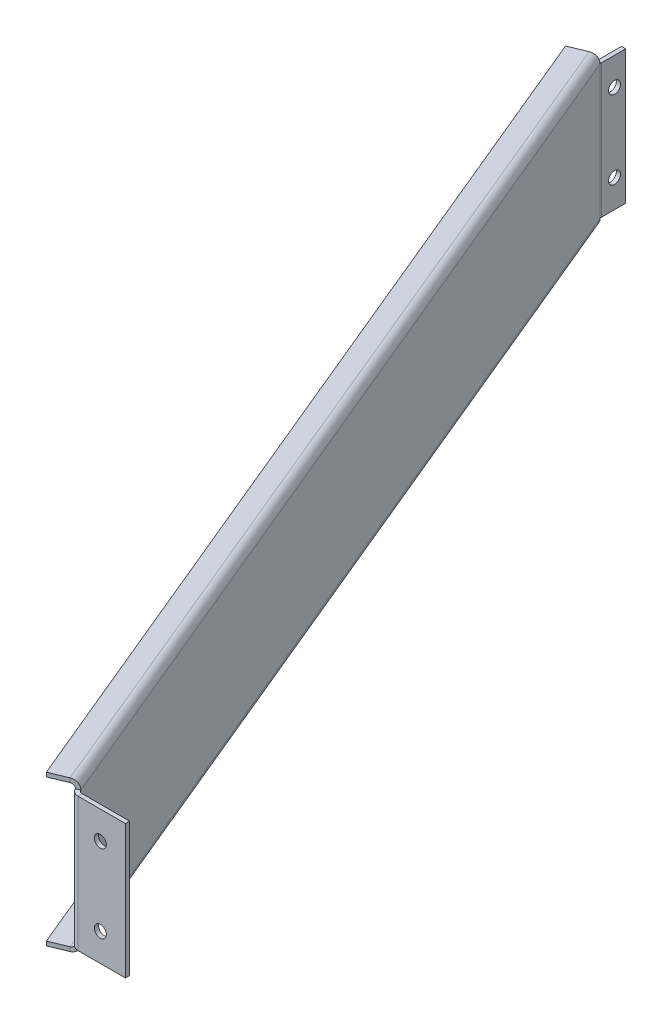
ISO-10303-21;
HEADER;
FILE_DESCRIPTION(('STEP AP214'),'2;1');
FILE_NAME('part.step','',(''),(''),'','','');
FILE_SCHEMA(('AUTOMOTIVE_DESIGN { 1 0 10303 214 1 1 1 1 }'));
ENDSEC;
DATA;
#1=APPLICATION_CONTEXT('core data for automotive mechanical design processes');
#2=APPLICATION_PROTOCOL_DEFINITION('international standard','automotive_design',2000,#1);
#3=PRODUCT_CONTEXT('',#1,'mechanical');
#4=PRODUCT('Part','Part','',(#3));
#5=PRODUCT_RELATED_PRODUCT_CATEGORY('part','',(#4));
#6=PRODUCT_DEFINITION_FORMATION('','',#4);
#7=PRODUCT_DEFINITION_CONTEXT('part definition',#1,'design');
#8=PRODUCT_DEFINITION('design','',#6,#7);
#9=PRODUCT_DEFINITION_SHAPE('','',#8);
#10=(LENGTH_UNIT() NAMED_UNIT(*) SI_UNIT(.MILLI.,.METRE.));
#11=(NAMED_UNIT(*) PLANE_ANGLE_UNIT() SI_UNIT($,.RADIAN.));
#12=(NAMED_UNIT(*) SI_UNIT($,.STERADIAN.) SOLID_ANGLE_UNIT());
#13=UNCERTAINTY_MEASURE_WITH_UNIT(LENGTH_MEASURE(1.E-05),#10,'distance_accuracy_value','');
#14=(GEOMETRIC_REPRESENTATION_CONTEXT(3) GLOBAL_UNCERTAINTY_ASSIGNED_CONTEXT((#13)) GLOBAL_UNIT_ASSIGNED_CONTEXT((#10,
#11,#12)) REPRESENTATION_CONTEXT('',''));
#15=CARTESIAN_POINT('',(0.,0.,0.));
#16=DIRECTION('',(0.,0.,1.));
#17=DIRECTION('',(1.,0.,0.));
#18=AXIS2_PLACEMENT_3D('',#15,#16,#17);
#19=CARTESIAN_POINT('',(63.1148729100365,24.,-319.72361405104));
#20=DIRECTION('',(0.,1.,0.));
#21=DIRECTION('',(0.,0.,1.));
#22=AXIS2_PLACEMENT_3D('',#19,#20,#21);
#23=PLANE('',#22);
#24=DIRECTION('',(-0.923418059975633,0.,0.383795631177372));
#25=VECTOR('',#24,1.);
#26=CARTESIAN_POINT('',(63.1148729100365,24.,-319.72361405104));
#27=LINE('',#26,#25);
#28=CARTESIAN_POINT('',(63.1148729100359,24.,-319.72361405104));
#29=VERTEX_POINT('',#28);
#30=CARTESIAN_POINT('',(61.7297458200725,24.,-319.147920604274));
#31=VERTEX_POINT('',#30);
#32=EDGE_CURVE('E13',#29,#31,#27,.T.);
#33=ORIENTED_EDGE('',*,*,#32,.F.);
#34=CARTESIAN_POINT('',(64.5,24.,-320.299307497806));
#35=DIRECTION('',(0.,-1.,0.));
#36=DIRECTION('',(0.,0.,-1.));
#37=AXIS2_PLACEMENT_3D('',#34,#35,#36);
#38=CIRCLE('',#37,1.5);
#39=CARTESIAN_POINT('',(63.,24.,-320.299307497806));
#40=VERTEX_POINT('',#39);
#41=EDGE_CURVE('E231',#40,#29,#38,.F.);
#42=ORIENTED_EDGE('',*,*,#41,.F.);
#43=DIRECTION('',(1.,0.,0.));
#44=VECTOR('',#43,1.);
#45=CARTESIAN_POINT('',(61.5,24.,-320.299307497806));
#46=LINE('',#45,#44);
#47=CARTESIAN_POINT('',(61.5,24.,-320.299307497806));
#48=VERTEX_POINT('',#47);
#49=EDGE_CURVE('E93',#48,#40,#46,.T.);
#50=ORIENTED_EDGE('',*,*,#49,.F.);
#51=CARTESIAN_POINT('',(64.5,24.,-320.299307497806));
#52=DIRECTION('',(0.,1.,0.));
#53=DIRECTION('',(1.,0.,0.));
#54=AXIS2_PLACEMENT_3D('',#51,#52,#53);
#55=CIRCLE('',#54,3.);
#56=EDGE_CURVE('E221',#48,#31,#55,.T.);
#57=ORIENTED_EDGE('',*,*,#56,.T.);
#58=EDGE_LOOP('',(#33,#42,#50,#57));
#59=FACE_BOUND('',#58,.T.);
#60=ADVANCED_FACE('F84',(#59),#23,.T.);
#61=CARTESIAN_POINT('',(63.,-24.,-320.299307497806));
#62=DIRECTION('',(0.,-1.,0.));
#63=DIRECTION('',(0.,0.,-1.));
#64=AXIS2_PLACEMENT_3D('',#61,#62,#63);
#65=PLANE('',#64);
#66=DIRECTION('',(-1.,0.,0.));
#67=VECTOR('',#66,1.);
#68=CARTESIAN_POINT('',(63.,-24.,-320.299307497806));
#69=LINE('',#68,#67);
#70=CARTESIAN_POINT('',(63.,-24.,-320.299307497806));
#71=VERTEX_POINT('',#70);
#72=CARTESIAN_POINT('',(61.5,-24.,-320.299307497806));
#73=VERTEX_POINT('',#72);
#74=EDGE_CURVE('E338',#71,#73,#69,.T.);
#75=ORIENTED_EDGE('',*,*,#74,.F.);
#76=CARTESIAN_POINT('',(64.5,-24.,-320.299307497806));
#77=DIRECTION('',(0.,-1.,0.));
#78=DIRECTION('',(0.,0.,-1.));
#79=AXIS2_PLACEMENT_3D('',#76,#77,#78);
#80=CIRCLE('',#79,1.5);
#81=CARTESIAN_POINT('',(63.1148729100366,-24.,-319.72361405104));
#82=VERTEX_POINT('',#81);
#83=EDGE_CURVE('E266',#71,#82,#80,.F.);
#84=ORIENTED_EDGE('',*,*,#83,.T.);
#85=DIRECTION('',(0.923418059975633,0.,-0.383795631177372));
#86=VECTOR('',#85,1.);
#87=CARTESIAN_POINT('',(61.7297458200731,-24.,-319.147920604274));
#88=LINE('',#87,#86);
#89=CARTESIAN_POINT('',(61.7297458200731,-24.,-319.147920604274));
#90=VERTEX_POINT('',#89);
#91=EDGE_CURVE('E334',#90,#82,#88,.T.);
#92=ORIENTED_EDGE('',*,*,#91,.F.);
#93=CARTESIAN_POINT('',(64.5,-24.,-320.299307497806));
#94=DIRECTION('',(0.,1.,0.));
#95=DIRECTION('',(1.,0.,0.));
#96=AXIS2_PLACEMENT_3D('',#93,#94,#95);
#97=CIRCLE('',#96,3.);
#98=EDGE_CURVE('E279',#73,#90,#97,.T.);
#99=ORIENTED_EDGE('',*,*,#98,.F.);
#100=EDGE_LOOP('',(#75,#84,#92,#99));
#101=FACE_BOUND('',#100,.T.);
#102=ADVANCED_FACE('F362',(#101),#65,.T.);
#103=CARTESIAN_POINT('',(61.7297458200731,-24.,-319.147920604274));
#104=DIRECTION('',(0.,-1.,0.));
#105=DIRECTION('',(0.,0.,-1.));
#106=AXIS2_PLACEMENT_3D('',#103,#104,#105);
#107=PLANE('',#106);
#108=DIRECTION('',(0.,0.,1.));
#109=VECTOR('',#108,1.);
#110=CARTESIAN_POINT('',(63.,-24.,-329.));
#111=LINE('',#110,#109);
#112=CARTESIAN_POINT('',(63.,-24.,-329.));
#113=VERTEX_POINT('',#112);
#114=EDGE_CURVE('E270',#113,#71,#111,.T.);
#115=ORIENTED_EDGE('',*,*,#114,.T.);
#116=ORIENTED_EDGE('',*,*,#74,.T.);
#117=DIRECTION('',(0.,0.,-1.));
#118=VECTOR('',#117,1.);
#119=CARTESIAN_POINT('',(61.5,-24.,-329.));
#120=LINE('',#119,#118);
#121=CARTESIAN_POINT('',(61.5,-24.,-329.));
#122=VERTEX_POINT('',#121);
#123=EDGE_CURVE('E276',#122,#73,#120,.F.);
#124=ORIENTED_EDGE('',*,*,#123,.F.);
#125=DIRECTION('',(1.,0.,0.));
#126=VECTOR('',#125,1.);
#127=CARTESIAN_POINT('',(61.5,-24.,-329.));
#128=LINE('',#127,#126);
#129=EDGE_CURVE('E205',#122,#113,#128,.T.);
#130=ORIENTED_EDGE('',*,*,#129,.T.);
#131=EDGE_LOOP('',(#115,#116,#124,#130));
#132=FACE_BOUND('',#131,.T.);
#133=ADVANCED_FACE('F356',(#132),#107,.T.);
#134=CARTESIAN_POINT('',(197.000962178776,24.,0.));
#135=DIRECTION('',(0.,1.,0.));
#136=DIRECTION('',(0.,0.,1.));
#137=AXIS2_PLACEMENT_3D('',#134,#135,#136);
#138=PLANE('',#137);
#139=DIRECTION('',(0.,0.,1.));
#140=VECTOR('',#139,1.);
#141=CARTESIAN_POINT('',(197.000962178776,24.,0.));
#142=LINE('',#141,#140);
#143=CARTESIAN_POINT('',(197.000962178776,24.,0.));
#144=VERTEX_POINT('',#143);
#145=CARTESIAN_POINT('',(197.000962178776,24.,1.5));
#146=VERTEX_POINT('',#145);
#147=EDGE_CURVE('E104',#144,#146,#142,.T.);
#148=ORIENTED_EDGE('',*,*,#147,.F.);
#149=CARTESIAN_POINT('',(197.000962178776,24.,-1.49999999999995));
#150=DIRECTION('',(0.,-1.,0.));
#151=DIRECTION('',(0.,0.,-1.));
#152=AXIS2_PLACEMENT_3D('',#149,#150,#151);
#153=CIRCLE('',#152,1.5);
#154=CARTESIAN_POINT('',(195.615835088812,24.,-0.924306553233778));
#155=VERTEX_POINT('',#154);
#156=EDGE_CURVE('E472',#155,#144,#153,.F.);
#157=ORIENTED_EDGE('',*,*,#156,.F.);
#158=DIRECTION('',(0.923418059975609,0.,-0.383795631177431));
#159=VECTOR('',#158,1.);
#160=CARTESIAN_POINT('',(194.230707998849,24.,-0.348613106467666));
#161=LINE('',#160,#159);
#162=CARTESIAN_POINT('',(194.230707998849,24.,-0.348613106467777));
#163=VERTEX_POINT('',#162);
#164=EDGE_CURVE('E328',#163,#155,#161,.T.);
#165=ORIENTED_EDGE('',*,*,#164,.F.);
#166=CARTESIAN_POINT('',(197.000962178776,24.,-1.49999999999995));
#167=DIRECTION('',(0.,1.,0.));
#168=DIRECTION('',(1.,0.,0.));
#169=AXIS2_PLACEMENT_3D('',#166,#167,#168);
#170=CIRCLE('',#169,3.);
#171=EDGE_CURVE('E242',#163,#146,#170,.T.);
#172=ORIENTED_EDGE('',*,*,#171,.T.);
#173=EDGE_LOOP('',(#148,#157,#165,#172));
#174=FACE_BOUND('',#173,.T.);
#175=ADVANCED_FACE('F554',(#174),#138,.T.);
#176=CARTESIAN_POINT('',(194.230707998849,24.,-0.348613106467666));
#177=DIRECTION('',(0.,1.,0.));
#178=DIRECTION('',(0.,0.,1.));
#179=AXIS2_PLACEMENT_3D('',#176,#177,#178);
#180=PLANE('',#179);
#181=DIRECTION('',(1.,0.,0.));
#182=VECTOR('',#181,1.);
#183=CARTESIAN_POINT('',(196.,24.,0.));
#184=LINE('',#183,#182);
#185=CARTESIAN_POINT('',(214.,24.,0.));
#186=VERTEX_POINT('',#185);
#187=EDGE_CURVE('E468',#144,#186,#184,.T.);
#188=ORIENTED_EDGE('',*,*,#187,.F.);
#189=ORIENTED_EDGE('',*,*,#147,.T.);
#190=DIRECTION('',(1.,0.,0.));
#191=VECTOR('',#190,1.);
#192=CARTESIAN_POINT('',(196.,24.,1.5));
#193=LINE('',#192,#191);
#194=CARTESIAN_POINT('',(214.,24.,1.5));
#195=VERTEX_POINT('',#194);
#196=EDGE_CURVE('E172',#146,#195,#193,.T.);
#197=ORIENTED_EDGE('',*,*,#196,.T.);
#198=DIRECTION('',(0.,0.,1.));
#199=VECTOR('',#198,1.);
#200=CARTESIAN_POINT('',(214.,24.,0.));
#201=LINE('',#200,#199);
#202=EDGE_CURVE('E464',#186,#195,#201,.T.);
#203=ORIENTED_EDGE('',*,*,#202,.F.);
#204=EDGE_LOOP('',(#188,#189,#197,#203));
#205=FACE_BOUND('',#204,.T.);
#206=ADVANCED_FACE('F561',(#205),#180,.T.);
#207=CARTESIAN_POINT('',(195.615835088812,-24.,-0.924306553233778));
#208=DIRECTION('',(0.,-1.,0.));
#209=DIRECTION('',(0.,0.,-1.));
#210=AXIS2_PLACEMENT_3D('',#207,#208,#209);
#211=PLANE('',#210);
#212=DIRECTION('',(-0.923418059975609,0.,0.383795631177431));
#213=VECTOR('',#212,1.);
#214=CARTESIAN_POINT('',(195.615835088812,-24.,-0.924306553233778));
#215=LINE('',#214,#213);
#216=CARTESIAN_POINT('',(195.615835088812,-24.,-0.924306553233445));
#217=VERTEX_POINT('',#216);
#218=CARTESIAN_POINT('',(194.230707998849,-24.,-0.348613106467666));
#219=VERTEX_POINT('',#218);
#220=EDGE_CURVE('E324',#217,#219,#215,.T.);
#221=ORIENTED_EDGE('',*,*,#220,.F.);
#222=CARTESIAN_POINT('',(197.000962178776,-24.,-1.49999999999995));
#223=DIRECTION('',(0.,-1.,0.));
#224=DIRECTION('',(0.,0.,-1.));
#225=AXIS2_PLACEMENT_3D('',#222,#223,#224);
#226=CIRCLE('',#225,1.5);
#227=CARTESIAN_POINT('',(197.000962178776,-24.,0.));
#228=VERTEX_POINT('',#227);
#229=EDGE_CURVE('E259',#217,#228,#226,.F.);
#230=ORIENTED_EDGE('',*,*,#229,.T.);
#231=DIRECTION('',(0.,0.,-1.));
#232=VECTOR('',#231,1.);
#233=CARTESIAN_POINT('',(197.000962178776,-24.,1.5));
#234=LINE('',#233,#232);
#235=CARTESIAN_POINT('',(197.000962178776,-24.,1.5));
#236=VERTEX_POINT('',#235);
#237=EDGE_CURVE('E166',#236,#228,#234,.T.);
#238=ORIENTED_EDGE('',*,*,#237,.F.);
#239=CARTESIAN_POINT('',(197.000962178776,-24.,-1.49999999999995));
#240=DIRECTION('',(0.,1.,0.));
#241=DIRECTION('',(1.,0.,0.));
#242=AXIS2_PLACEMENT_3D('',#239,#240,#241);
#243=CIRCLE('',#242,3.);
#244=EDGE_CURVE('E285',#219,#236,#243,.T.);
#245=ORIENTED_EDGE('',*,*,#244,.F.);
#246=EDGE_LOOP('',(#221,#230,#238,#245));
#247=FACE_BOUND('',#246,.T.);
#248=ADVANCED_FACE('F572',(#247),#211,.T.);
#249=CARTESIAN_POINT('',(196.,24.,1.5));
#250=DIRECTION('',(0.,0.,-1.));
#251=DIRECTION('',(-1.,0.,0.));
#252=AXIS2_PLACEMENT_3D('',#249,#250,#251);
#253=PLANE('',#252);
#254=CARTESIAN_POINT('',(205.,14.,1.5));
#255=DIRECTION('',(0.,0.,-1.));
#256=DIRECTION('',(-1.,0.,0.));
#257=AXIS2_PLACEMENT_3D('',#254,#255,#256);
#258=CIRCLE('',#257,2.15000000000001);
#259=CARTESIAN_POINT('',(202.85,14.,1.5));
#260=VERTEX_POINT('',#259);
#261=EDGE_CURVE('E650',#260,#260,#258,.T.);
#262=ORIENTED_EDGE('',*,*,#261,.T.);
#263=EDGE_LOOP('',(#262));
#264=FACE_BOUND('',#263,.T.);
#265=CARTESIAN_POINT('',(205.,-14.,1.5));
#266=DIRECTION('',(0.,0.,-1.));
#267=DIRECTION('',(-1.,0.,0.));
#268=AXIS2_PLACEMENT_3D('',#265,#266,#267);
#269=CIRCLE('',#268,2.15000000000001);
#270=CARTESIAN_POINT('',(202.85,-14.,1.5));
#271=VERTEX_POINT('',#270);
#272=EDGE_CURVE('E642',#271,#271,#269,.T.);
#273=ORIENTED_EDGE('',*,*,#272,.T.);
#274=EDGE_LOOP('',(#273));
#275=FACE_BOUND('',#274,.T.);
#276=DIRECTION('',(1.,0.,0.));
#277=VECTOR('',#276,1.);
#278=CARTESIAN_POINT('',(196.,-24.,1.5));
#279=LINE('',#278,#277);
#280=CARTESIAN_POINT('',(214.,-24.,1.5));
#281=VERTEX_POINT('',#280);
#282=EDGE_CURVE('E246',#236,#281,#279,.T.);
#283=ORIENTED_EDGE('',*,*,#282,.T.);
#284=DIRECTION('',(0.,-1.,0.));
#285=VECTOR('',#284,1.);
#286=CARTESIAN_POINT('',(214.,24.,1.5));
#287=LINE('',#286,#285);
#288=EDGE_CURVE('E319',#195,#281,#287,.T.);
#289=ORIENTED_EDGE('',*,*,#288,.F.);
#290=ORIENTED_EDGE('',*,*,#196,.F.);
#291=DIRECTION('',(0.,-1.,0.));
#292=VECTOR('',#291,1.);
#293=CARTESIAN_POINT('',(197.000962178776,24.,1.5));
#294=LINE('',#293,#292);
#295=EDGE_CURVE('E245',#146,#236,#294,.T.);
#296=ORIENTED_EDGE('',*,*,#295,.T.);
#297=EDGE_LOOP('',(#283,#289,#290,#296));
#298=FACE_BOUND('',#297,.T.);
#299=ADVANCED_FACE('F569',(#264,#275,#298),#253,.F.);
#300=CARTESIAN_POINT('',(214.,24.,0.));
#301=DIRECTION('',(1.,0.,0.));
#302=DIRECTION('',(0.,0.,-1.));
#303=AXIS2_PLACEMENT_3D('',#300,#301,#302);
#304=PLANE('',#303);
#305=DIRECTION('',(0.,0.,1.));
#306=VECTOR('',#305,1.);
#307=CARTESIAN_POINT('',(214.,-24.,0.));
#308=LINE('',#307,#306);
#309=CARTESIAN_POINT('',(214.,-24.,0.));
#310=VERTEX_POINT('',#309);
#311=EDGE_CURVE('E250',#310,#281,#308,.T.);
#312=ORIENTED_EDGE('',*,*,#311,.F.);
#313=DIRECTION('',(0.,-1.,0.));
#314=VECTOR('',#313,1.);
#315=CARTESIAN_POINT('',(214.,24.,0.));
#316=LINE('',#315,#314);
#317=EDGE_CURVE('E316',#186,#310,#316,.T.);
#318=ORIENTED_EDGE('',*,*,#317,.F.);
#319=ORIENTED_EDGE('',*,*,#202,.T.);
#320=ORIENTED_EDGE('',*,*,#288,.T.);
#321=EDGE_LOOP('',(#312,#318,#319,#320));
#322=FACE_BOUND('',#321,.T.);
#323=ADVANCED_FACE('F564',(#322),#304,.T.);
#324=CARTESIAN_POINT('',(196.,24.,0.));
#325=DIRECTION('',(0.,0.,-1.));
#326=DIRECTION('',(-1.,0.,0.));
#327=AXIS2_PLACEMENT_3D('',#324,#325,#326);
#328=PLANE('',#327);
#329=CARTESIAN_POINT('',(205.,14.,0.));
#330=DIRECTION('',(0.,0.,-1.));
#331=DIRECTION('',(-1.,0.,0.));
#332=AXIS2_PLACEMENT_3D('',#329,#330,#331);
#333=CIRCLE('',#332,2.15000000000001);
#334=CARTESIAN_POINT('',(202.85,14.,0.));
#335=VERTEX_POINT('',#334);
#336=EDGE_CURVE('E654',#335,#335,#333,.T.);
#337=ORIENTED_EDGE('',*,*,#336,.F.);
#338=EDGE_LOOP('',(#337));
#339=FACE_BOUND('',#338,.T.);
#340=CARTESIAN_POINT('',(205.,-14.,0.));
#341=DIRECTION('',(0.,0.,-1.));
#342=DIRECTION('',(-1.,0.,0.));
#343=AXIS2_PLACEMENT_3D('',#340,#341,#342);
#344=CIRCLE('',#343,2.15000000000001);
#345=CARTESIAN_POINT('',(202.85,-14.,0.));
#346=VERTEX_POINT('',#345);
#347=EDGE_CURVE('E646',#346,#346,#344,.T.);
#348=ORIENTED_EDGE('',*,*,#347,.F.);
#349=EDGE_LOOP('',(#348));
#350=FACE_BOUND('',#349,.T.);
#351=DIRECTION('',(1.,0.,0.));
#352=VECTOR('',#351,1.);
#353=CARTESIAN_POINT('',(196.,-24.,0.));
#354=LINE('',#353,#352);
#355=EDGE_CURVE('E255',#228,#310,#354,.T.);
#356=ORIENTED_EDGE('',*,*,#355,.F.);
#357=DIRECTION('',(0.,-1.,0.));
#358=VECTOR('',#357,1.);
#359=CARTESIAN_POINT('',(197.000962178776,24.,0.));
#360=LINE('',#359,#358);
#361=EDGE_CURVE('E312',#144,#228,#360,.T.);
#362=ORIENTED_EDGE('',*,*,#361,.F.);
#363=ORIENTED_EDGE('',*,*,#187,.T.);
#364=ORIENTED_EDGE('',*,*,#317,.T.);
#365=EDGE_LOOP('',(#356,#362,#363,#364));
#366=FACE_BOUND('',#365,.T.);
#367=ADVANCED_FACE('F560',(#339,#350,#366),#328,.T.);
#368=CARTESIAN_POINT('',(197.000962178776,24.,-1.49999999999995));
#369=DIRECTION('',(0.,-1.,0.));
#370=DIRECTION('',(0.,0.,-1.));
#371=AXIS2_PLACEMENT_3D('',#368,#369,#370);
#372=CYLINDRICAL_SURFACE('',#371,1.5);
#373=ORIENTED_EDGE('',*,*,#229,.F.);
#374=DIRECTION('',(0.,-1.,0.));
#375=VECTOR('',#374,1.);
#376=CARTESIAN_POINT('',(195.615835088812,24.,-0.924306553233778));
#377=LINE('',#376,#375);
#378=EDGE_CURVE('E308',#155,#217,#377,.T.);
#379=ORIENTED_EDGE('',*,*,#378,.F.);
#380=ORIENTED_EDGE('',*,*,#156,.T.);
#381=ORIENTED_EDGE('',*,*,#361,.T.);
#382=EDGE_LOOP('',(#373,#379,#380,#381));
#383=FACE_BOUND('',#382,.T.);
#384=ADVANCED_FACE('F553',(#383),#372,.F.);
#385=CARTESIAN_POINT('',(63.,24.,-320.));
#386=DIRECTION('',(0.923418059975633,0.,-0.383795631177373));
#387=DIRECTION('',(-0.383795631177373,0.,-0.923418059975633));
#388=AXIS2_PLACEMENT_3D('',#385,#386,#387);
#389=PLANE('',#388);
#390=DIRECTION('',(0.383795631177373,0.,0.923418059975633));
#391=VECTOR('',#390,1.);
#392=CARTESIAN_POINT('',(63.,-24.,-320.));
#393=LINE('',#392,#391);
#394=EDGE_CURVE('E262',#82,#217,#393,.T.);
#395=ORIENTED_EDGE('',*,*,#394,.F.);
#396=DIRECTION('',(0.,-1.,0.));
#397=VECTOR('',#396,1.);
#398=CARTESIAN_POINT('',(63.1148729100365,24.,-319.72361405104));
#399=LINE('',#398,#397);
#400=EDGE_CURVE('E305',#29,#82,#399,.T.);
#401=ORIENTED_EDGE('',*,*,#400,.F.);
#402=DIRECTION('',(0.383795631177373,0.,0.923418059975633));
#403=VECTOR('',#402,1.);
#404=CARTESIAN_POINT('',(63.,24.,-320.));
#405=LINE('',#404,#403);
#406=EDGE_CURVE('E353',#29,#155,#405,.T.);
#407=ORIENTED_EDGE('',*,*,#406,.T.);
#408=ORIENTED_EDGE('',*,*,#378,.T.);
#409=EDGE_LOOP('',(#395,#401,#407,#408));
#410=FACE_BOUND('',#409,.T.);
#411=ADVANCED_FACE('F480',(#410),#389,.T.);
#412=CARTESIAN_POINT('',(64.5,24.,-320.299307497806));
#413=DIRECTION('',(0.,-1.,0.));
#414=DIRECTION('',(0.,0.,-1.));
#415=AXIS2_PLACEMENT_3D('',#412,#413,#414);
#416=CYLINDRICAL_SURFACE('',#415,1.5);
#417=ORIENTED_EDGE('',*,*,#83,.F.);
#418=DIRECTION('',(0.,-1.,0.));
#419=VECTOR('',#418,1.);
#420=CARTESIAN_POINT('',(63.,24.,-320.299307497806));
#421=LINE('',#420,#419);
#422=EDGE_CURVE('E301',#40,#71,#421,.T.);
#423=ORIENTED_EDGE('',*,*,#422,.F.);
#424=ORIENTED_EDGE('',*,*,#41,.T.);
#425=ORIENTED_EDGE('',*,*,#400,.T.);
#426=EDGE_LOOP('',(#417,#423,#424,#425));
#427=FACE_BOUND('',#426,.T.);
#428=ADVANCED_FACE('F348',(#427),#416,.F.);
#429=CARTESIAN_POINT('',(63.,24.,-329.));
#430=DIRECTION('',(1.,0.,0.));
#431=DIRECTION('',(0.,0.,-1.));
#432=AXIS2_PLACEMENT_3D('',#429,#430,#431);
#433=PLANE('',#432);
#434=CARTESIAN_POINT('',(63.,14.,-325.));
#435=DIRECTION('',(1.,0.,0.));
#436=DIRECTION('',(0.,0.,-1.));
#437=AXIS2_PLACEMENT_3D('',#434,#435,#436);
#438=CIRCLE('',#437,2.15);
#439=CARTESIAN_POINT('',(63.,14.,-327.15));
#440=VERTEX_POINT('',#439);
#441=EDGE_CURVE('E639',#440,#440,#438,.T.);
#442=ORIENTED_EDGE('',*,*,#441,.F.);
#443=EDGE_LOOP('',(#442));
#444=FACE_BOUND('',#443,.T.);
#445=CARTESIAN_POINT('',(63.,-14.,-325.));
#446=DIRECTION('',(1.,0.,0.));
#447=DIRECTION('',(0.,0.,-1.));
#448=AXIS2_PLACEMENT_3D('',#445,#446,#447);
#449=CIRCLE('',#448,2.15);
#450=CARTESIAN_POINT('',(63.,-14.,-327.15));
#451=VERTEX_POINT('',#450);
#452=EDGE_CURVE('E631',#451,#451,#449,.T.);
#453=ORIENTED_EDGE('',*,*,#452,.F.);
#454=EDGE_LOOP('',(#453));
#455=FACE_BOUND('',#454,.T.);
#456=ORIENTED_EDGE('',*,*,#114,.F.);
#457=DIRECTION('',(0.,-1.,0.));
#458=VECTOR('',#457,1.);
#459=CARTESIAN_POINT('',(63.,24.,-329.));
#460=LINE('',#459,#458);
#461=CARTESIAN_POINT('',(63.,24.,-329.));
#462=VERTEX_POINT('',#461);
#463=EDGE_CURVE('E210',#462,#113,#460,.T.);
#464=ORIENTED_EDGE('',*,*,#463,.F.);
#465=DIRECTION('',(0.,0.,1.));
#466=VECTOR('',#465,1.);
#467=CARTESIAN_POINT('',(63.,24.,-329.));
#468=LINE('',#467,#466);
#469=EDGE_CURVE('E226',#462,#40,#468,.T.);
#470=ORIENTED_EDGE('',*,*,#469,.T.);
#471=ORIENTED_EDGE('',*,*,#422,.T.);
#472=EDGE_LOOP('',(#456,#464,#470,#471));
#473=FACE_BOUND('',#472,.T.);
#474=ADVANCED_FACE('F354',(#444,#455,#473),#433,.T.);
#475=CARTESIAN_POINT('',(61.5,24.,-329.));
#476=DIRECTION('',(0.,0.,-1.));
#477=DIRECTION('',(-1.,0.,0.));
#478=AXIS2_PLACEMENT_3D('',#475,#476,#477);
#479=PLANE('',#478);
#480=ORIENTED_EDGE('',*,*,#129,.F.);
#481=DIRECTION('',(0.,-1.,0.));
#482=VECTOR('',#481,1.);
#483=CARTESIAN_POINT('',(61.5,24.,-329.));
#484=LINE('',#483,#482);
#485=CARTESIAN_POINT('',(61.5,24.,-329.));
#486=VERTEX_POINT('',#485);
#487=EDGE_CURVE('E199',#486,#122,#484,.T.);
#488=ORIENTED_EDGE('',*,*,#487,.F.);
#489=DIRECTION('',(1.,0.,0.));
#490=VECTOR('',#489,1.);
#491=CARTESIAN_POINT('',(61.5,24.,-329.));
#492=LINE('',#491,#490);
#493=EDGE_CURVE('E203',#486,#462,#492,.T.);
#494=ORIENTED_EDGE('',*,*,#493,.T.);
#495=ORIENTED_EDGE('',*,*,#463,.T.);
#496=EDGE_LOOP('',(#480,#488,#494,#495));
#497=FACE_BOUND('',#496,.T.);
#498=ADVANCED_FACE('F201',(#497),#479,.T.);
#499=CARTESIAN_POINT('',(61.5,24.,-329.));
#500=DIRECTION('',(1.,0.,0.));
#501=DIRECTION('',(0.,0.,-1.));
#502=AXIS2_PLACEMENT_3D('',#499,#500,#501);
#503=PLANE('',#502);
#504=CARTESIAN_POINT('',(61.5,14.,-325.));
#505=DIRECTION('',(1.,0.,0.));
#506=DIRECTION('',(0.,0.,-1.));
#507=AXIS2_PLACEMENT_3D('',#504,#505,#506);
#508=CIRCLE('',#507,2.15);
#509=CARTESIAN_POINT('',(61.5,14.,-327.15));
#510=VERTEX_POINT('',#509);
#511=EDGE_CURVE('E635',#510,#510,#508,.T.);
#512=ORIENTED_EDGE('',*,*,#511,.T.);
#513=EDGE_LOOP('',(#512));
#514=FACE_BOUND('',#513,.T.);
#515=CARTESIAN_POINT('',(61.5,-14.,-325.));
#516=DIRECTION('',(1.,0.,0.));
#517=DIRECTION('',(0.,0.,-1.));
#518=AXIS2_PLACEMENT_3D('',#515,#516,#517);
#519=CIRCLE('',#518,2.15);
#520=CARTESIAN_POINT('',(61.5,-14.,-327.15));
#521=VERTEX_POINT('',#520);
#522=EDGE_CURVE('E595',#521,#521,#519,.T.);
#523=ORIENTED_EDGE('',*,*,#522,.T.);
#524=EDGE_LOOP('',(#523));
#525=FACE_BOUND('',#524,.T.);
#526=ORIENTED_EDGE('',*,*,#123,.T.);
#527=DIRECTION('',(0.,-1.,0.));
#528=VECTOR('',#527,1.);
#529=CARTESIAN_POINT('',(61.5,24.,-320.299307497806));
#530=LINE('',#529,#528);
#531=EDGE_CURVE('E211',#48,#73,#530,.T.);
#532=ORIENTED_EDGE('',*,*,#531,.F.);
#533=DIRECTION('',(0.,0.,-1.));
#534=VECTOR('',#533,1.);
#535=CARTESIAN_POINT('',(61.5,24.,-329.));
#536=LINE('',#535,#534);
#537=EDGE_CURVE('E215',#486,#48,#536,.F.);
#538=ORIENTED_EDGE('',*,*,#537,.F.);
#539=ORIENTED_EDGE('',*,*,#487,.T.);
#540=EDGE_LOOP('',(#526,#532,#538,#539));
#541=FACE_BOUND('',#540,.T.);
#542=ADVANCED_FACE('F216',(#514,#525,#541),#503,.F.);
#543=CARTESIAN_POINT('',(64.5,24.,-320.299307497806));
#544=DIRECTION('',(0.,-1.,0.));
#545=DIRECTION('',(0.,0.,-1.));
#546=AXIS2_PLACEMENT_3D('',#543,#544,#545);
#547=CYLINDRICAL_SURFACE('',#546,3.);
#548=ORIENTED_EDGE('',*,*,#98,.T.);
#549=DIRECTION('',(0.,-1.,0.));
#550=VECTOR('',#549,1.);
#551=CARTESIAN_POINT('',(61.7297458200731,24.,-319.147920604274));
#552=LINE('',#551,#550);
#553=EDGE_CURVE('E294',#31,#90,#552,.T.);
#554=ORIENTED_EDGE('',*,*,#553,.F.);
#555=ORIENTED_EDGE('',*,*,#56,.F.);
#556=ORIENTED_EDGE('',*,*,#531,.T.);
#557=EDGE_LOOP('',(#548,#554,#555,#556));
#558=FACE_BOUND('',#557,.T.);
#559=ADVANCED_FACE('F359',(#558),#547,.T.);
#560=CARTESIAN_POINT('',(61.6148729100366,24.,-319.424306553234));
#561=DIRECTION('',(0.923418059975633,0.,-0.383795631177373));
#562=DIRECTION('',(-0.383795631177373,0.,-0.923418059975633));
#563=AXIS2_PLACEMENT_3D('',#560,#561,#562);
#564=PLANE('',#563);
#565=DIRECTION('',(0.383795631177373,0.,0.923418059975633));
#566=VECTOR('',#565,1.);
#567=CARTESIAN_POINT('',(61.6148729100366,-24.,-319.424306553234));
#568=LINE('',#567,#566);
#569=EDGE_CURVE('E157',#90,#219,#568,.T.);
#570=ORIENTED_EDGE('',*,*,#569,.T.);
#571=DIRECTION('',(0.,-1.,0.));
#572=VECTOR('',#571,1.);
#573=CARTESIAN_POINT('',(194.230707998849,24.,-0.348613106467666));
#574=LINE('',#573,#572);
#575=EDGE_CURVE('E291',#163,#219,#574,.T.);
#576=ORIENTED_EDGE('',*,*,#575,.F.);
#577=DIRECTION('',(0.383795631177373,0.,0.923418059975633));
#578=VECTOR('',#577,1.);
#579=CARTESIAN_POINT('',(61.6148729100366,24.,-319.424306553234));
#580=LINE('',#579,#578);
#581=EDGE_CURVE('E238',#31,#163,#580,.T.);
#582=ORIENTED_EDGE('',*,*,#581,.F.);
#583=ORIENTED_EDGE('',*,*,#553,.T.);
#584=EDGE_LOOP('',(#570,#576,#582,#583));
#585=FACE_BOUND('',#584,.T.);
#586=ADVANCED_FACE('F717',(#585),#564,.F.);
#587=CARTESIAN_POINT('',(197.000962178776,24.,-1.49999999999995));
#588=DIRECTION('',(0.,-1.,0.));
#589=DIRECTION('',(0.,0.,-1.));
#590=AXIS2_PLACEMENT_3D('',#587,#588,#589);
#591=CYLINDRICAL_SURFACE('',#590,3.);
#592=ORIENTED_EDGE('',*,*,#244,.T.);
#593=ORIENTED_EDGE('',*,*,#295,.F.);
#594=ORIENTED_EDGE('',*,*,#171,.F.);
#595=ORIENTED_EDGE('',*,*,#575,.T.);
#596=EDGE_LOOP('',(#592,#593,#594,#595));
#597=FACE_BOUND('',#596,.T.);
#598=ADVANCED_FACE('F571',(#597),#591,.T.);
#599=CARTESIAN_POINT('',(197.000962178776,24.,-1.49999999999995));
#600=DIRECTION('',(0.,-1.,0.));
#601=DIRECTION('',(-1.,0.,0.));
#602=AXIS2_PLACEMENT_3D('',#599,#600,#601);
#603=PLANE('',#602);
#604=ORIENTED_EDGE('',*,*,#537,.T.);
#605=ORIENTED_EDGE('',*,*,#49,.T.);
#606=ORIENTED_EDGE('',*,*,#469,.F.);
#607=ORIENTED_EDGE('',*,*,#493,.F.);
#608=EDGE_LOOP('',(#604,#605,#606,#607));
#609=FACE_BOUND('',#608,.T.);
#610=ADVANCED_FACE('F224',(#609),#603,.F.);
#611=CARTESIAN_POINT('',(197.000962178776,-24.,-1.49999999999995));
#612=DIRECTION('',(0.,-1.,0.));
#613=DIRECTION('',(-1.,0.,0.));
#614=AXIS2_PLACEMENT_3D('',#611,#612,#613);
#615=PLANE('',#614);
#616=ORIENTED_EDGE('',*,*,#282,.F.);
#617=ORIENTED_EDGE('',*,*,#237,.T.);
#618=ORIENTED_EDGE('',*,*,#355,.T.);
#619=ORIENTED_EDGE('',*,*,#311,.T.);
#620=EDGE_LOOP('',(#616,#617,#618,#619));
#621=FACE_BOUND('',#620,.T.);
#622=ADVANCED_FACE('F567',(#621),#615,.T.);
#623=CARTESIAN_POINT('',(192.845580908886,24.,0.22708034029828));
#624=DIRECTION('',(0.383795631177376,0.,0.923418059975632));
#625=DIRECTION('',(0.923418059975632,0.,-0.383795631177376));
#626=AXIS2_PLACEMENT_3D('',#623,#624,#625);
#627=PLANE('',#626);
#628=DIRECTION('',(0.,-1.,0.));
#629=VECTOR('',#628,1.);
#630=CARTESIAN_POINT('',(192.845580908885,27.,0.227080340298391));
#631=LINE('',#630,#629);
#632=CARTESIAN_POINT('',(192.845580908886,25.5,0.22708034029828));
#633=VERTEX_POINT('',#632);
#634=CARTESIAN_POINT('',(192.845580908886,27.,0.227080340298391));
#635=VERTEX_POINT('',#634);
#636=EDGE_CURVE('E384',#633,#635,#631,.F.);
#637=ORIENTED_EDGE('',*,*,#636,.F.);
#638=CARTESIAN_POINT('',(192.845580908886,24.,0.22708034029828));
#639=DIRECTION('',(-0.383795631177376,0.,-0.923418059975632));
#640=DIRECTION('',(-0.923418059975632,0.,0.383795631177376));
#641=AXIS2_PLACEMENT_3D('',#638,#639,#640);
#642=CIRCLE('',#641,1.5);
#643=EDGE_CURVE('E455',#163,#633,#642,.F.);
#644=ORIENTED_EDGE('',*,*,#643,.F.);
#645=ORIENTED_EDGE('',*,*,#164,.T.);
#646=CARTESIAN_POINT('',(192.845580908886,24.,0.227080340298391));
#647=DIRECTION('',(-0.383795631177376,0.,-0.923418059975632));
#648=DIRECTION('',(-0.923418059975632,0.,0.383795631177376));
#649=AXIS2_PLACEMENT_3D('',#646,#647,#648);
#650=CIRCLE('',#649,3.);
#651=EDGE_CURVE('E251',#155,#635,#650,.F.);
#652=ORIENTED_EDGE('',*,*,#651,.T.);
#653=EDGE_LOOP('',(#637,#644,#645,#652));
#654=FACE_BOUND('',#653,.T.);
#655=ADVANCED_FACE('F547',(#654),#627,.T.);
#656=CARTESIAN_POINT('',(60.344618730109,24.,-318.572227157507));
#657=DIRECTION('',(0.383795631177376,0.,0.923418059975632));
#658=DIRECTION('',(0.923418059975632,0.,-0.383795631177376));
#659=AXIS2_PLACEMENT_3D('',#656,#657,#658);
#660=PLANE('',#659);
#661=CARTESIAN_POINT('',(60.344618730109,24.,-318.572227157507));
#662=DIRECTION('',(-0.383795631177376,0.,-0.923418059975632));
#663=DIRECTION('',(-0.923418059975632,0.,0.383795631177376));
#664=AXIS2_PLACEMENT_3D('',#661,#662,#663);
#665=CIRCLE('',#664,1.5);
#666=CARTESIAN_POINT('',(60.344618730109,25.5,-318.572227157507));
#667=VERTEX_POINT('',#666);
#668=EDGE_CURVE('E408',#667,#31,#665,.T.);
#669=ORIENTED_EDGE('',*,*,#668,.F.);
#670=DIRECTION('',(0.,-1.,0.));
#671=VECTOR('',#670,1.);
#672=CARTESIAN_POINT('',(60.3446187301097,25.5,-318.572227157508));
#673=LINE('',#672,#671);
#674=CARTESIAN_POINT('',(60.3446187301097,27.,-318.572227157508));
#675=VERTEX_POINT('',#674);
#676=EDGE_CURVE('E441',#667,#675,#673,.F.);
#677=ORIENTED_EDGE('',*,*,#676,.T.);
#678=CARTESIAN_POINT('',(60.344618730109,24.,-318.572227157507));
#679=DIRECTION('',(-0.383795631177376,0.,-0.923418059975632));
#680=DIRECTION('',(-0.923418059975632,0.,0.383795631177376));
#681=AXIS2_PLACEMENT_3D('',#678,#679,#680);
#682=CIRCLE('',#681,3.);
#683=EDGE_CURVE('E451',#675,#29,#682,.T.);
#684=ORIENTED_EDGE('',*,*,#683,.T.);
#685=ORIENTED_EDGE('',*,*,#32,.T.);
#686=EDGE_LOOP('',(#669,#677,#684,#685));
#687=FACE_BOUND('',#686,.T.);
#688=ADVANCED_FACE('F492',(#687),#660,.F.);
#689=CARTESIAN_POINT('',(60.344618730109,24.,-318.572227157508));
#690=DIRECTION('',(-0.383795631177376,0.,-0.923418059975632));
#691=DIRECTION('',(0.,1.,0.));
#692=AXIS2_PLACEMENT_3D('',#689,#690,#691);
#693=CYLINDRICAL_SURFACE('',#692,3.);
#694=ORIENTED_EDGE('',*,*,#406,.F.);
#695=ORIENTED_EDGE('',*,*,#683,.F.);
#696=DIRECTION('',(-0.383795631177373,0.,-0.923418059975633));
#697=VECTOR('',#696,1.);
#698=CARTESIAN_POINT('',(192.845580908885,27.,0.227080340298391));
#699=LINE('',#698,#697);
#700=EDGE_CURVE('E437',#675,#635,#699,.F.);
#701=ORIENTED_EDGE('',*,*,#700,.T.);
#702=ORIENTED_EDGE('',*,*,#651,.F.);
#703=EDGE_LOOP('',(#694,#695,#701,#702));
#704=FACE_BOUND('',#703,.T.);
#705=ADVANCED_FACE('F485',(#704),#693,.T.);
#706=CARTESIAN_POINT('',(60.344618730109,24.,-318.572227157508));
#707=DIRECTION('',(-0.383795631177376,0.,-0.923418059975632));
#708=DIRECTION('',(0.,1.,0.));
#709=AXIS2_PLACEMENT_3D('',#706,#707,#708);
#710=CYLINDRICAL_SURFACE('',#709,1.5);
#711=ORIENTED_EDGE('',*,*,#581,.T.);
#712=ORIENTED_EDGE('',*,*,#643,.T.);
#713=DIRECTION('',(-0.383795631177373,0.,-0.923418059975633));
#714=VECTOR('',#713,1.);
#715=CARTESIAN_POINT('',(192.845580908885,25.5,0.227080340298391));
#716=LINE('',#715,#714);
#717=EDGE_CURVE('E389',#633,#667,#716,.T.);
#718=ORIENTED_EDGE('',*,*,#717,.T.);
#719=ORIENTED_EDGE('',*,*,#668,.T.);
#720=EDGE_LOOP('',(#711,#712,#718,#719));
#721=FACE_BOUND('',#720,.T.);
#722=ADVANCED_FACE('F539',(#721),#710,.F.);
#723=CARTESIAN_POINT('',(54.3424013402681,27.,-316.077555554855));
#724=DIRECTION('',(0.383795631177375,0.,0.923418059975632));
#725=DIRECTION('',(0.923418059975632,0.,-0.383795631177375));
#726=AXIS2_PLACEMENT_3D('',#723,#724,#725);
#727=PLANE('',#726);
#728=ORIENTED_EDGE('',*,*,#676,.F.);
#729=DIRECTION('',(0.923418059975632,0.,-0.383795631177375));
#730=VECTOR('',#729,1.);
#731=CARTESIAN_POINT('',(54.3424013402681,25.5,-316.077555554855));
#732=LINE('',#731,#730);
#733=CARTESIAN_POINT('',(54.3424013402681,25.5,-316.077555554855));
#734=VERTEX_POINT('',#733);
#735=EDGE_CURVE('E433',#667,#734,#732,.F.);
#736=ORIENTED_EDGE('',*,*,#735,.T.);
#737=DIRECTION('',(0.,-1.,0.));
#738=VECTOR('',#737,1.);
#739=CARTESIAN_POINT('',(54.3424013402681,27.,-316.077555554855));
#740=LINE('',#739,#738);
#741=CARTESIAN_POINT('',(54.342401340268,27.,-316.077555554855));
#742=VERTEX_POINT('',#741);
#743=EDGE_CURVE('E404',#742,#734,#740,.T.);
#744=ORIENTED_EDGE('',*,*,#743,.F.);
#745=DIRECTION('',(-0.923418059975632,0.,0.383795631177375));
#746=VECTOR('',#745,1.);
#747=CARTESIAN_POINT('',(-104.01450613384,27.0000000000006,-250.260465885928));
#748=LINE('',#747,#746);
#749=EDGE_CURVE('E421',#675,#742,#748,.T.);
#750=ORIENTED_EDGE('',*,*,#749,.F.);
#751=EDGE_LOOP('',(#728,#736,#744,#750));
#752=FACE_BOUND('',#751,.T.);
#753=ADVANCED_FACE('F507',(#752),#727,.F.);
#754=CARTESIAN_POINT('',(194.230707998849,27.,-0.348613106467666));
#755=DIRECTION('',(-0.383795631177373,0.,-0.923418059975633));
#756=DIRECTION('',(-0.923418059975633,0.,0.383795631177373));
#757=AXIS2_PLACEMENT_3D('',#754,#755,#756);
#758=PLANE('',#757);
#759=ORIENTED_EDGE('',*,*,#636,.T.);
#760=DIRECTION('',(0.923418059975633,0.,-0.383795631177373));
#761=VECTOR('',#760,1.);
#762=CARTESIAN_POINT('',(28.4864560449366,27.0000000000006,68.5388416118772));
#763=LINE('',#762,#761);
#764=CARTESIAN_POINT('',(186.843363519044,27.,2.72175194295132));
#765=VERTEX_POINT('',#764);
#766=EDGE_CURVE('E413',#765,#635,#763,.T.);
#767=ORIENTED_EDGE('',*,*,#766,.F.);
#768=DIRECTION('',(0.,-1.,0.));
#769=VECTOR('',#768,1.);
#770=CARTESIAN_POINT('',(186.843363519044,27.,2.72175194295132));
#771=LINE('',#770,#769);
#772=CARTESIAN_POINT('',(186.843363519044,25.5,2.72175194295132));
#773=VERTEX_POINT('',#772);
#774=EDGE_CURVE('E409',#765,#773,#771,.T.);
#775=ORIENTED_EDGE('',*,*,#774,.T.);
#776=DIRECTION('',(-0.923418059975633,0.,0.383795631177373));
#777=VECTOR('',#776,1.);
#778=CARTESIAN_POINT('',(194.230707998849,25.5,-0.348613106467666));
#779=LINE('',#778,#777);
#780=EDGE_CURVE('E425',#773,#633,#779,.F.);
#781=ORIENTED_EDGE('',*,*,#780,.T.);
#782=EDGE_LOOP('',(#759,#767,#775,#781));
#783=FACE_BOUND('',#782,.T.);
#784=ADVANCED_FACE('F545',(#783),#758,.F.);
#785=CARTESIAN_POINT('',(0.,27.0000000000006,0.));
#786=DIRECTION('',(0.,-1.,0.));
#787=DIRECTION('',(1.,0.,0.));
#788=AXIS2_PLACEMENT_3D('',#785,#786,#787);
#789=PLANE('',#788);
#790=ORIENTED_EDGE('',*,*,#700,.F.);
#791=ORIENTED_EDGE('',*,*,#749,.T.);
#792=DIRECTION('',(0.383795631177373,0.,0.923418059975633));
#793=VECTOR('',#792,1.);
#794=CARTESIAN_POINT('',(158.356907474107,27.,-65.8170896689259));
#795=LINE('',#794,#793);
#796=EDGE_CURVE('E417',#742,#765,#795,.T.);
#797=ORIENTED_EDGE('',*,*,#796,.T.);
#798=ORIENTED_EDGE('',*,*,#766,.T.);
#799=EDGE_LOOP('',(#790,#791,#797,#798));
#800=FACE_BOUND('',#799,.T.);
#801=ADVANCED_FACE('F503',(#800),#789,.F.);
#802=CARTESIAN_POINT('',(0.,25.5000000000006,0.));
#803=DIRECTION('',(0.,-1.,0.));
#804=DIRECTION('',(1.,0.,0.));
#805=AXIS2_PLACEMENT_3D('',#802,#803,#804);
#806=PLANE('',#805);
#807=ORIENTED_EDGE('',*,*,#735,.F.);
#808=ORIENTED_EDGE('',*,*,#717,.F.);
#809=ORIENTED_EDGE('',*,*,#780,.F.);
#810=DIRECTION('',(-0.383795631177373,0.,-0.923418059975633));
#811=VECTOR('',#810,1.);
#812=CARTESIAN_POINT('',(186.843363519044,25.5,2.72175194295132));
#813=LINE('',#812,#811);
#814=EDGE_CURVE('E429',#734,#773,#813,.F.);
#815=ORIENTED_EDGE('',*,*,#814,.F.);
#816=EDGE_LOOP('',(#807,#808,#809,#815));
#817=FACE_BOUND('',#816,.T.);
#818=ADVANCED_FACE('F543',(#817),#806,.T.);
#819=CARTESIAN_POINT('',(186.843363519044,27.,2.72175194295132));
#820=DIRECTION('',(0.923418059975633,0.,-0.383795631177373));
#821=DIRECTION('',(-0.383795631177373,0.,-0.923418059975633));
#822=AXIS2_PLACEMENT_3D('',#819,#820,#821);
#823=PLANE('',#822);
#824=ORIENTED_EDGE('',*,*,#814,.T.);
#825=ORIENTED_EDGE('',*,*,#774,.F.);
#826=ORIENTED_EDGE('',*,*,#796,.F.);
#827=ORIENTED_EDGE('',*,*,#743,.T.);
#828=EDGE_LOOP('',(#824,#825,#826,#827));
#829=FACE_BOUND('',#828,.T.);
#830=ADVANCED_FACE('F516',(#829),#823,.F.);
#831=CARTESIAN_POINT('',(60.3446187301103,-24.,-318.572227157508));
#832=DIRECTION('',(-0.383795631177369,0.,-0.923418059975635));
#833=DIRECTION('',(-0.923418059975635,0.,0.383795631177369));
#834=AXIS2_PLACEMENT_3D('',#831,#832,#833);
#835=PLANE('',#834);
#836=DIRECTION('',(0.,1.,0.));
#837=VECTOR('',#836,1.);
#838=CARTESIAN_POINT('',(60.3446187301097,-27.,-318.572227157508));
#839=LINE('',#838,#837);
#840=CARTESIAN_POINT('',(60.3446187301103,-25.5,-318.572227157508));
#841=VERTEX_POINT('',#840);
#842=CARTESIAN_POINT('',(60.3446187301103,-27.,-318.572227157508));
#843=VERTEX_POINT('',#842);
#844=EDGE_CURVE('E394',#841,#843,#839,.F.);
#845=ORIENTED_EDGE('',*,*,#844,.F.);
#846=CARTESIAN_POINT('',(60.3446187301103,-24.,-318.572227157508));
#847=DIRECTION('',(0.383795631177369,0.,0.923418059975635));
#848=DIRECTION('',(0.923418059975635,0.,-0.383795631177369));
#849=AXIS2_PLACEMENT_3D('',#846,#847,#848);
#850=CIRCLE('',#849,1.5);
#851=EDGE_CURVE('E373',#90,#841,#850,.F.);
#852=ORIENTED_EDGE('',*,*,#851,.F.);
#853=ORIENTED_EDGE('',*,*,#91,.T.);
#854=CARTESIAN_POINT('',(60.3446187301103,-24.,-318.572227157508));
#855=DIRECTION('',(0.383795631177369,0.,0.923418059975635));
#856=DIRECTION('',(0.923418059975635,0.,-0.383795631177369));
#857=AXIS2_PLACEMENT_3D('',#854,#855,#856);
#858=CIRCLE('',#857,3.);
#859=EDGE_CURVE('E370',#82,#843,#858,.F.);
#860=ORIENTED_EDGE('',*,*,#859,.T.);
#861=EDGE_LOOP('',(#845,#852,#853,#860));
#862=FACE_BOUND('',#861,.T.);
#863=ADVANCED_FACE('F368',(#862),#835,.T.);
#864=CARTESIAN_POINT('',(192.845580908885,-24.,0.227080340298669));
#865=DIRECTION('',(-0.383795631177369,0.,-0.923418059975635));
#866=DIRECTION('',(-0.923418059975635,0.,0.383795631177369));
#867=AXIS2_PLACEMENT_3D('',#864,#865,#866);
#868=PLANE('',#867);
#869=CARTESIAN_POINT('',(192.845580908885,-24.,0.227080340298669));
#870=DIRECTION('',(0.383795631177369,0.,0.923418059975635));
#871=DIRECTION('',(0.923418059975635,0.,-0.383795631177369));
#872=AXIS2_PLACEMENT_3D('',#869,#870,#871);
#873=CIRCLE('',#872,1.5);
#874=CARTESIAN_POINT('',(192.845580908885,-25.5,0.227080340298669));
#875=VERTEX_POINT('',#874);
#876=EDGE_CURVE('E399',#875,#219,#873,.T.);
#877=ORIENTED_EDGE('',*,*,#876,.F.);
#878=DIRECTION('',(0.,1.,0.));
#879=VECTOR('',#878,1.);
#880=CARTESIAN_POINT('',(192.845580908885,-25.5,0.227080340298391));
#881=LINE('',#880,#879);
#882=CARTESIAN_POINT('',(192.845580908885,-27.,0.227080340298336));
#883=VERTEX_POINT('',#882);
#884=EDGE_CURVE('E590',#875,#883,#881,.F.);
#885=ORIENTED_EDGE('',*,*,#884,.T.);
#886=CARTESIAN_POINT('',(192.845580908885,-24.,0.227080340298669));
#887=DIRECTION('',(0.383795631177369,0.,0.923418059975635));
#888=DIRECTION('',(0.923418059975635,0.,-0.383795631177369));
#889=AXIS2_PLACEMENT_3D('',#886,#887,#888);
#890=CIRCLE('',#889,3.);
#891=EDGE_CURVE('E385',#883,#217,#890,.T.);
#892=ORIENTED_EDGE('',*,*,#891,.T.);
#893=ORIENTED_EDGE('',*,*,#220,.T.);
#894=EDGE_LOOP('',(#877,#885,#892,#893));
#895=FACE_BOUND('',#894,.T.);
#896=ADVANCED_FACE('F575',(#895),#868,.F.);
#897=CARTESIAN_POINT('',(192.845580908885,-24.,0.22708034029878));
#898=DIRECTION('',(0.383795631177369,0.,0.923418059975635));
#899=DIRECTION('',(0.,-1.,0.));
#900=AXIS2_PLACEMENT_3D('',#897,#898,#899);
#901=CYLINDRICAL_SURFACE('',#900,3.);
#902=ORIENTED_EDGE('',*,*,#394,.T.);
#903=ORIENTED_EDGE('',*,*,#891,.F.);
#904=DIRECTION('',(0.383795631177373,0.,0.923418059975633));
#905=VECTOR('',#904,1.);
#906=CARTESIAN_POINT('',(60.3446187301097,-27.,-318.572227157508));
#907=LINE('',#906,#905);
#908=EDGE_CURVE('E382',#883,#843,#907,.F.);
#909=ORIENTED_EDGE('',*,*,#908,.T.);
#910=ORIENTED_EDGE('',*,*,#859,.F.);
#911=EDGE_LOOP('',(#902,#903,#909,#910));
#912=FACE_BOUND('',#911,.T.);
#913=ADVANCED_FACE('F376',(#912),#901,.T.);
#914=CARTESIAN_POINT('',(192.845580908885,-24.,0.22708034029878));
#915=DIRECTION('',(0.383795631177369,0.,0.923418059975635));
#916=DIRECTION('',(0.,-1.,0.));
#917=AXIS2_PLACEMENT_3D('',#914,#915,#916);
#918=CYLINDRICAL_SURFACE('',#917,1.5);
#919=ORIENTED_EDGE('',*,*,#569,.F.);
#920=ORIENTED_EDGE('',*,*,#851,.T.);
#921=DIRECTION('',(0.383795631177373,0.,0.923418059975633));
#922=VECTOR('',#921,1.);
#923=CARTESIAN_POINT('',(60.3446187301097,-25.5,-318.572227157508));
#924=LINE('',#923,#922);
#925=EDGE_CURVE('E582',#841,#875,#924,.T.);
#926=ORIENTED_EDGE('',*,*,#925,.T.);
#927=ORIENTED_EDGE('',*,*,#876,.T.);
#928=EDGE_LOOP('',(#919,#920,#926,#927));
#929=FACE_BOUND('',#928,.T.);
#930=ADVANCED_FACE('F580',(#929),#918,.F.);
#931=CARTESIAN_POINT('',(61.7297458200731,-27.,-319.147920604274));
#932=DIRECTION('',(0.383795631177375,0.,0.923418059975632));
#933=DIRECTION('',(0.923418059975632,0.,-0.383795631177375));
#934=AXIS2_PLACEMENT_3D('',#931,#932,#933);
#935=PLANE('',#934);
#936=ORIENTED_EDGE('',*,*,#844,.T.);
#937=DIRECTION('',(0.923418059975632,0.,-0.383795631177375));
#938=VECTOR('',#937,1.);
#939=CARTESIAN_POINT('',(-104.01450613384,-27.0000000000006,-250.260465885928));
#940=LINE('',#939,#938);
#941=CARTESIAN_POINT('',(54.3424013402681,-27.,-316.077555554855));
#942=VERTEX_POINT('',#941);
#943=EDGE_CURVE('E609',#942,#843,#940,.T.);
#944=ORIENTED_EDGE('',*,*,#943,.F.);
#945=DIRECTION('',(0.,1.,0.));
#946=VECTOR('',#945,1.);
#947=CARTESIAN_POINT('',(54.3424013402681,-27.,-316.077555554855));
#948=LINE('',#947,#946);
#949=CARTESIAN_POINT('',(54.3424013402681,-25.5,-316.077555554855));
#950=VERTEX_POINT('',#949);
#951=EDGE_CURVE('E621',#942,#950,#948,.T.);
#952=ORIENTED_EDGE('',*,*,#951,.T.);
#953=DIRECTION('',(-0.923418059975632,0.,0.383795631177375));
#954=VECTOR('',#953,1.);
#955=CARTESIAN_POINT('',(61.7297458200731,-25.5,-319.147920604274));
#956=LINE('',#955,#954);
#957=EDGE_CURVE('E598',#950,#841,#956,.F.);
#958=ORIENTED_EDGE('',*,*,#957,.T.);
#959=EDGE_LOOP('',(#936,#944,#952,#958));
#960=FACE_BOUND('',#959,.T.);
#961=ADVANCED_FACE('F750',(#960),#935,.F.);
#962=CARTESIAN_POINT('',(186.843363519044,-27.,2.72175194295132));
#963=DIRECTION('',(-0.383795631177373,0.,-0.923418059975633));
#964=DIRECTION('',(-0.923418059975633,0.,0.383795631177373));
#965=AXIS2_PLACEMENT_3D('',#962,#963,#964);
#966=PLANE('',#965);
#967=ORIENTED_EDGE('',*,*,#884,.F.);
#968=DIRECTION('',(0.923418059975633,0.,-0.383795631177373));
#969=VECTOR('',#968,1.);
#970=CARTESIAN_POINT('',(186.843363519044,-25.5,2.72175194295132));
#971=LINE('',#970,#969);
#972=CARTESIAN_POINT('',(186.843363519044,-25.5,2.72175194295132));
#973=VERTEX_POINT('',#972);
#974=EDGE_CURVE('E601',#875,#973,#971,.F.);
#975=ORIENTED_EDGE('',*,*,#974,.T.);
#976=DIRECTION('',(0.,1.,0.));
#977=VECTOR('',#976,1.);
#978=CARTESIAN_POINT('',(186.843363519044,-27.,2.72175194295132));
#979=LINE('',#978,#977);
#980=CARTESIAN_POINT('',(186.843363519044,-27.,2.72175194295132));
#981=VERTEX_POINT('',#980);
#982=EDGE_CURVE('E403',#981,#973,#979,.T.);
#983=ORIENTED_EDGE('',*,*,#982,.F.);
#984=DIRECTION('',(-0.923418059975633,0.,0.383795631177373));
#985=VECTOR('',#984,1.);
#986=CARTESIAN_POINT('',(28.4864560449366,-27.0000000000006,68.5388416118772));
#987=LINE('',#986,#985);
#988=EDGE_CURVE('E613',#883,#981,#987,.T.);
#989=ORIENTED_EDGE('',*,*,#988,.F.);
#990=EDGE_LOOP('',(#967,#975,#983,#989));
#991=FACE_BOUND('',#990,.T.);
#992=ADVANCED_FACE('F755',(#991),#966,.F.);
#993=CARTESIAN_POINT('',(0.,-27.0000000000006,0.));
#994=DIRECTION('',(0.,1.,0.));
#995=DIRECTION('',(-1.,0.,0.));
#996=AXIS2_PLACEMENT_3D('',#993,#994,#995);
#997=PLANE('',#996);
#998=ORIENTED_EDGE('',*,*,#908,.F.);
#999=ORIENTED_EDGE('',*,*,#988,.T.);
#1000=DIRECTION('',(-0.383795631177373,0.,-0.923418059975633));
#1001=VECTOR('',#1000,1.);
#1002=CARTESIAN_POINT('',(158.356907474107,-27.,-65.8170896689259));
#1003=LINE('',#1002,#1001);
#1004=EDGE_CURVE('E617',#981,#942,#1003,.T.);
#1005=ORIENTED_EDGE('',*,*,#1004,.T.);
#1006=ORIENTED_EDGE('',*,*,#943,.T.);
#1007=EDGE_LOOP('',(#998,#999,#1005,#1006));
#1008=FACE_BOUND('',#1007,.T.);
#1009=ADVANCED_FACE('F759',(#1008),#997,.F.);
#1010=CARTESIAN_POINT('',(0.,-25.5000000000006,0.));
#1011=DIRECTION('',(0.,1.,0.));
#1012=DIRECTION('',(-1.,0.,0.));
#1013=AXIS2_PLACEMENT_3D('',#1010,#1011,#1012);
#1014=PLANE('',#1013);
#1015=ORIENTED_EDGE('',*,*,#974,.F.);
#1016=ORIENTED_EDGE('',*,*,#925,.F.);
#1017=ORIENTED_EDGE('',*,*,#957,.F.);
#1018=DIRECTION('',(0.383795631177373,0.,0.923418059975633));
#1019=VECTOR('',#1018,1.);
#1020=CARTESIAN_POINT('',(54.3424013402681,-25.5,-316.077555554855));
#1021=LINE('',#1020,#1019);
#1022=EDGE_CURVE('E605',#973,#950,#1021,.F.);
#1023=ORIENTED_EDGE('',*,*,#1022,.F.);
#1024=EDGE_LOOP('',(#1015,#1016,#1017,#1023));
#1025=FACE_BOUND('',#1024,.T.);
#1026=ADVANCED_FACE('F764',(#1025),#1014,.T.);
#1027=CARTESIAN_POINT('',(54.3424013402681,-27.,-316.077555554855));
#1028=DIRECTION('',(0.923418059975633,0.,-0.383795631177373));
#1029=DIRECTION('',(-0.383795631177373,0.,-0.923418059975633));
#1030=AXIS2_PLACEMENT_3D('',#1027,#1028,#1029);
#1031=PLANE('',#1030);
#1032=ORIENTED_EDGE('',*,*,#1022,.T.);
#1033=ORIENTED_EDGE('',*,*,#951,.F.);
#1034=ORIENTED_EDGE('',*,*,#1004,.F.);
#1035=ORIENTED_EDGE('',*,*,#982,.T.);
#1036=EDGE_LOOP('',(#1032,#1033,#1034,#1035));
#1037=FACE_BOUND('',#1036,.T.);
#1038=ADVANCED_FACE('F761',(#1037),#1031,.F.);
#1039=CARTESIAN_POINT('',(63.,-14.,-325.));
#1040=DIRECTION('',(1.,0.,0.));
#1041=DIRECTION('',(0.,0.,-1.));
#1042=AXIS2_PLACEMENT_3D('',#1039,#1040,#1041);
#1043=CYLINDRICAL_SURFACE('',#1042,2.15);
#1044=ORIENTED_EDGE('',*,*,#522,.F.);
#1045=EDGE_LOOP('',(#1044));
#1046=FACE_BOUND('',#1045,.T.);
#1047=ORIENTED_EDGE('',*,*,#452,.T.);
#1048=EDGE_LOOP('',(#1047));
#1049=FACE_BOUND('',#1048,.T.);
#1050=ADVANCED_FACE('F677',(#1046,#1049),#1043,.F.);
#1051=CARTESIAN_POINT('',(63.,14.,-325.));
#1052=DIRECTION('',(1.,0.,0.));
#1053=DIRECTION('',(0.,0.,-1.));
#1054=AXIS2_PLACEMENT_3D('',#1051,#1052,#1053);
#1055=CYLINDRICAL_SURFACE('',#1054,2.15);
#1056=ORIENTED_EDGE('',*,*,#511,.F.);
#1057=EDGE_LOOP('',(#1056));
#1058=FACE_BOUND('',#1057,.T.);
#1059=ORIENTED_EDGE('',*,*,#441,.T.);
#1060=EDGE_LOOP('',(#1059));
#1061=FACE_BOUND('',#1060,.T.);
#1062=ADVANCED_FACE('F668',(#1058,#1061),#1055,.F.);
#1063=CARTESIAN_POINT('',(205.,-14.,0.));
#1064=DIRECTION('',(0.,0.,-1.));
#1065=DIRECTION('',(-1.,0.,0.));
#1066=AXIS2_PLACEMENT_3D('',#1063,#1064,#1065);
#1067=CYLINDRICAL_SURFACE('',#1066,2.15000000000001);
#1068=ORIENTED_EDGE('',*,*,#272,.F.);
#1069=EDGE_LOOP('',(#1068));
#1070=FACE_BOUND('',#1069,.T.);
#1071=ORIENTED_EDGE('',*,*,#347,.T.);
#1072=EDGE_LOOP('',(#1071));
#1073=FACE_BOUND('',#1072,.T.);
#1074=ADVANCED_FACE('F666',(#1070,#1073),#1067,.F.);
#1075=CARTESIAN_POINT('',(205.,14.,0.));
#1076=DIRECTION('',(0.,0.,-1.));
#1077=DIRECTION('',(-1.,0.,0.));
#1078=AXIS2_PLACEMENT_3D('',#1075,#1076,#1077);
#1079=CYLINDRICAL_SURFACE('',#1078,2.15000000000001);
#1080=ORIENTED_EDGE('',*,*,#261,.F.);
#1081=EDGE_LOOP('',(#1080));
#1082=FACE_BOUND('',#1081,.T.);
#1083=ORIENTED_EDGE('',*,*,#336,.T.);
#1084=EDGE_LOOP('',(#1083));
#1085=FACE_BOUND('',#1084,.T.);
#1086=ADVANCED_FACE('F659',(#1082,#1085),#1079,.F.);
#1087=CLOSED_SHELL('',(#60,#102,#133,#175,#206,#248,#299,#323,#367,#384,#411,#428,#474,#498,
#542,#559,#586,#598,#610,#622,#655,#688,#705,#722,#753,#784,#801,#818,#830,#863,#896,#913,#930,
#961,#992,#1009,#1026,#1038,#1050,#1062,#1074,#1086));
#1088=MANIFOLD_SOLID_BREP('B2',#1087);
#1089=ADVANCED_BREP_SHAPE_REPRESENTATION('',(#18,#1088),#14);
#1090=SHAPE_DEFINITION_REPRESENTATION(#9,#1089);
ENDSEC;
END-ISO-10303-21;
